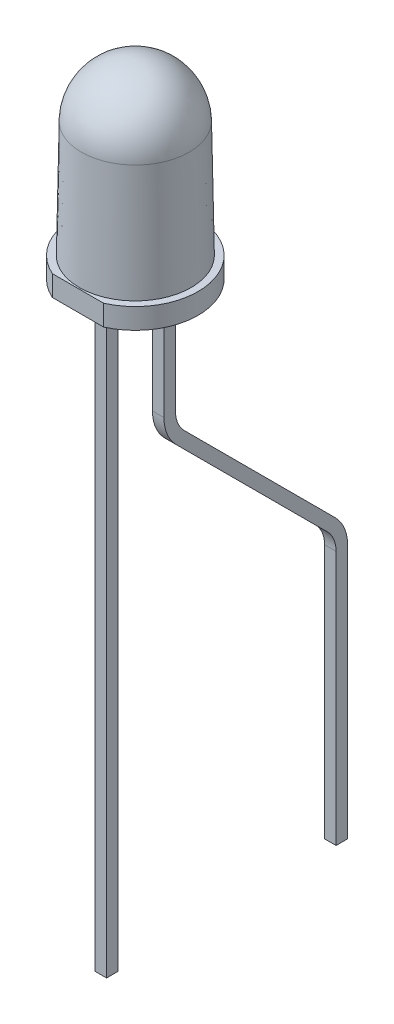
ISO-10303-21;
HEADER;
FILE_DESCRIPTION(('STEP AP214'),'2;1');
FILE_NAME('part.step','',(''),(''),'','','');
FILE_SCHEMA(('AUTOMOTIVE_DESIGN { 1 0 10303 214 1 1 1 1 }'));
ENDSEC;
DATA;
#1=APPLICATION_CONTEXT('core data for automotive mechanical design processes');
#2=APPLICATION_PROTOCOL_DEFINITION('international standard','automotive_design',2000,#1);
#3=PRODUCT_CONTEXT('',#1,'mechanical');
#4=PRODUCT('Part','Part','',(#3));
#5=PRODUCT_RELATED_PRODUCT_CATEGORY('part','',(#4));
#6=PRODUCT_DEFINITION_FORMATION('','',#4);
#7=PRODUCT_DEFINITION_CONTEXT('part definition',#1,'design');
#8=PRODUCT_DEFINITION('design','',#6,#7);
#9=PRODUCT_DEFINITION_SHAPE('','',#8);
#10=(LENGTH_UNIT() NAMED_UNIT(*) SI_UNIT(.MILLI.,.METRE.));
#11=(NAMED_UNIT(*) PLANE_ANGLE_UNIT() SI_UNIT($,.RADIAN.));
#12=(NAMED_UNIT(*) SI_UNIT($,.STERADIAN.) SOLID_ANGLE_UNIT());
#13=UNCERTAINTY_MEASURE_WITH_UNIT(LENGTH_MEASURE(1.E-05),#10,'distance_accuracy_value','');
#14=(GEOMETRIC_REPRESENTATION_CONTEXT(3) GLOBAL_UNCERTAINTY_ASSIGNED_CONTEXT((#13)) GLOBAL_UNIT_ASSIGNED_CONTEXT((#10,
#11,#12)) REPRESENTATION_CONTEXT('',''));
#15=CARTESIAN_POINT('',(0.,0.,0.));
#16=DIRECTION('',(0.,0.,1.));
#17=DIRECTION('',(1.,0.,0.));
#18=AXIS2_PLACEMENT_3D('',#15,#16,#17);
#19=CARTESIAN_POINT('',(0.,0.9144,-2.47649999999999));
#20=DIRECTION('',(0.,-1.,0.));
#21=DIRECTION('',(0.,0.,-1.));
#22=AXIS2_PLACEMENT_3D('',#19,#20,#21);
#23=PLANE('',#22);
#24=CARTESIAN_POINT('',(0.,0.914399999999998,0.));
#25=DIRECTION('',(0.,1.,0.));
#26=DIRECTION('',(0.,0.,1.));
#27=AXIS2_PLACEMENT_3D('',#24,#25,#26);
#28=CIRCLE('',#27,2.47649999999999);
#29=CARTESIAN_POINT('',(0.,0.914399999999995,2.4765));
#30=VERTEX_POINT('',#29);
#31=EDGE_CURVE('E299',#30,#30,#28,.T.);
#32=ORIENTED_EDGE('',*,*,#31,.F.);
#33=EDGE_LOOP('',(#32));
#34=FACE_BOUND('',#33,.T.);
#35=DIRECTION('',(-1.,0.,0.));
#36=VECTOR('',#35,1.);
#37=CARTESIAN_POINT('',(0.,0.914399999999994,2.54));
#38=LINE('',#37,#36);
#39=CARTESIAN_POINT('',(1.13315033865768,0.914399999999994,2.54));
#40=VERTEX_POINT('',#39);
#41=CARTESIAN_POINT('',(-1.1331503386577,0.914399999999994,2.53999999999999));
#42=VERTEX_POINT('',#41);
#43=EDGE_CURVE('E288',#40,#42,#38,.T.);
#44=ORIENTED_EDGE('',*,*,#43,.F.);
#45=CARTESIAN_POINT('',(0.,0.914399999999997,0.));
#46=DIRECTION('',(0.,1.,0.));
#47=DIRECTION('',(0.,0.,1.));
#48=AXIS2_PLACEMENT_3D('',#45,#46,#47);
#49=CIRCLE('',#48,2.7813);
#50=EDGE_CURVE('E290',#40,#42,#49,.T.);
#51=ORIENTED_EDGE('',*,*,#50,.T.);
#52=EDGE_LOOP('',(#44,#51));
#53=FACE_BOUND('',#52,.T.);
#54=ADVANCED_FACE('F32',(#34,#53),#23,.F.);
#55=CARTESIAN_POINT('',(0.,0.,0.));
#56=DIRECTION('',(0.,1.,0.));
#57=DIRECTION('',(0.,0.,1.));
#58=AXIS2_PLACEMENT_3D('',#55,#56,#57);
#59=PLANE('',#58);
#60=DIRECTION('',(1.,0.,0.));
#61=VECTOR('',#60,1.);
#62=CARTESIAN_POINT('',(0.254,0.,-1.016));
#63=LINE('',#62,#61);
#64=CARTESIAN_POINT('',(-0.254,0.,-1.016));
#65=VERTEX_POINT('',#64);
#66=CARTESIAN_POINT('',(0.254,0.,-1.016));
#67=VERTEX_POINT('',#66);
#68=EDGE_CURVE('E176',#65,#67,#63,.T.);
#69=ORIENTED_EDGE('',*,*,#68,.T.);
#70=DIRECTION('',(0.,0.,-1.));
#71=VECTOR('',#70,1.);
#72=CARTESIAN_POINT('',(0.254,0.,-1.016));
#73=LINE('',#72,#71);
#74=CARTESIAN_POINT('',(0.254,0.,-1.524));
#75=VERTEX_POINT('',#74);
#76=EDGE_CURVE('E414',#67,#75,#73,.T.);
#77=ORIENTED_EDGE('',*,*,#76,.T.);
#78=DIRECTION('',(-1.,0.,0.));
#79=VECTOR('',#78,1.);
#80=CARTESIAN_POINT('',(0.254,0.,-1.524));
#81=LINE('',#80,#79);
#82=CARTESIAN_POINT('',(-0.254,0.,-1.524));
#83=VERTEX_POINT('',#82);
#84=EDGE_CURVE('E180',#75,#83,#81,.T.);
#85=ORIENTED_EDGE('',*,*,#84,.T.);
#86=DIRECTION('',(0.,0.,1.));
#87=VECTOR('',#86,1.);
#88=CARTESIAN_POINT('',(-0.254,0.,-1.016));
#89=LINE('',#88,#87);
#90=EDGE_CURVE('E46',#83,#65,#89,.T.);
#91=ORIENTED_EDGE('',*,*,#90,.T.);
#92=EDGE_LOOP('',(#69,#77,#85,#91));
#93=FACE_BOUND('',#92,.T.);
#94=DIRECTION('',(1.,0.,0.));
#95=VECTOR('',#94,1.);
#96=CARTESIAN_POINT('',(0.254,0.,1.524));
#97=LINE('',#96,#95);
#98=CARTESIAN_POINT('',(-0.254,0.,1.524));
#99=VERTEX_POINT('',#98);
#100=CARTESIAN_POINT('',(0.254,0.,1.524));
#101=VERTEX_POINT('',#100);
#102=EDGE_CURVE('E261',#99,#101,#97,.T.);
#103=ORIENTED_EDGE('',*,*,#102,.T.);
#104=DIRECTION('',(0.,0.,-1.));
#105=VECTOR('',#104,1.);
#106=CARTESIAN_POINT('',(0.254,0.,1.524));
#107=LINE('',#106,#105);
#108=CARTESIAN_POINT('',(0.254,0.,1.016));
#109=VERTEX_POINT('',#108);
#110=EDGE_CURVE('E256',#101,#109,#107,.T.);
#111=ORIENTED_EDGE('',*,*,#110,.T.);
#112=DIRECTION('',(-1.,0.,0.));
#113=VECTOR('',#112,1.);
#114=CARTESIAN_POINT('',(0.254,0.,1.016));
#115=LINE('',#114,#113);
#116=CARTESIAN_POINT('',(-0.254,0.,1.016));
#117=VERTEX_POINT('',#116);
#118=EDGE_CURVE('E273',#109,#117,#115,.T.);
#119=ORIENTED_EDGE('',*,*,#118,.T.);
#120=DIRECTION('',(0.,0.,1.));
#121=VECTOR('',#120,1.);
#122=CARTESIAN_POINT('',(-0.254,0.,1.524));
#123=LINE('',#122,#121);
#124=EDGE_CURVE('E54',#117,#99,#123,.T.);
#125=ORIENTED_EDGE('',*,*,#124,.T.);
#126=EDGE_LOOP('',(#103,#111,#119,#125));
#127=FACE_BOUND('',#126,.T.);
#128=DIRECTION('',(1.,0.,0.));
#129=VECTOR('',#128,1.);
#130=CARTESIAN_POINT('',(0.,0.,2.54));
#131=LINE('',#130,#129);
#132=CARTESIAN_POINT('',(-1.1331503386577,0.,2.53999999999999));
#133=VERTEX_POINT('',#132);
#134=CARTESIAN_POINT('',(1.13315033865767,0.,2.54));
#135=VERTEX_POINT('',#134);
#136=EDGE_CURVE('E281',#133,#135,#131,.T.);
#137=ORIENTED_EDGE('',*,*,#136,.F.);
#138=CARTESIAN_POINT('',(0.,0.,0.));
#139=DIRECTION('',(0.,1.,0.));
#140=DIRECTION('',(0.,0.,1.));
#141=AXIS2_PLACEMENT_3D('',#138,#139,#140);
#142=CIRCLE('',#141,2.7813);
#143=EDGE_CURVE('E293',#135,#133,#142,.T.);
#144=ORIENTED_EDGE('',*,*,#143,.F.);
#145=EDGE_LOOP('',(#137,#144));
#146=FACE_BOUND('',#145,.T.);
#147=ADVANCED_FACE('F311',(#93,#127,#146),#59,.F.);
#148=CARTESIAN_POINT('',(0.,8.4074,0.));
#149=DIRECTION('',(0.,1.,0.));
#150=DIRECTION('',(0.,0.,1.));
#151=AXIS2_PLACEMENT_3D('',#148,#149,#150);
#152=CYLINDRICAL_SURFACE('',#151,2.7813);
#153=DIRECTION('',(0.,1.,0.));
#154=VECTOR('',#153,1.);
#155=CARTESIAN_POINT('',(1.1331503386577,8.4074,2.54));
#156=LINE('',#155,#154);
#157=EDGE_CURVE('E11',#135,#40,#156,.T.);
#158=ORIENTED_EDGE('',*,*,#157,.F.);
#159=ORIENTED_EDGE('',*,*,#143,.T.);
#160=DIRECTION('',(0.,1.,0.));
#161=VECTOR('',#160,1.);
#162=CARTESIAN_POINT('',(-1.1331503386577,8.4074,2.54));
#163=LINE('',#162,#161);
#164=EDGE_CURVE('E39',#42,#133,#163,.F.);
#165=ORIENTED_EDGE('',*,*,#164,.F.);
#166=ORIENTED_EDGE('',*,*,#50,.F.);
#167=EDGE_LOOP('',(#158,#159,#165,#166));
#168=FACE_BOUND('',#167,.T.);
#169=ADVANCED_FACE('F312',(#168),#152,.T.);
#170=CARTESIAN_POINT('',(0.,0.914399999999998,0.));
#171=DIRECTION('',(0.,-1.,0.));
#172=DIRECTION('',(0.,0.,-1.));
#173=AXIS2_PLACEMENT_3D('',#170,#171,#172);
#174=CONICAL_SURFACE('',#173,2.47649999999999,0.0172728670839645);
#175=CARTESIAN_POINT('',(0.,6.06068858252808,0.));
#176=DIRECTION('',(0.,1.,0.));
#177=DIRECTION('',(0.,0.,1.));
#178=AXIS2_PLACEMENT_3D('',#175,#176,#177);
#179=CIRCLE('',#178,2.3876);
#180=CARTESIAN_POINT('',(0.,6.06068858252808,2.3876));
#181=VERTEX_POINT('',#180);
#182=EDGE_CURVE('E296',#181,#181,#179,.T.);
#183=ORIENTED_EDGE('',*,*,#182,.F.);
#184=EDGE_LOOP('',(#183));
#185=FACE_BOUND('',#184,.T.);
#186=ORIENTED_EDGE('',*,*,#31,.T.);
#187=EDGE_LOOP('',(#186));
#188=FACE_BOUND('',#187,.T.);
#189=ADVANCED_FACE('F323',(#185,#188),#174,.T.);
#190=CARTESIAN_POINT('',(0.,6.01944378317489,0.));
#191=DIRECTION('',(0.,1.,0.));
#192=DIRECTION('',(0.,0.,-1.));
#193=AXIS2_PLACEMENT_3D('',#190,#191,#192);
#194=SPHERICAL_SURFACE('',#193,2.38795621682511);
#195=ORIENTED_EDGE('',*,*,#182,.T.);
#196=EDGE_LOOP('',(#195));
#197=FACE_BOUND('',#196,.T.);
#198=ADVANCED_FACE('F325',(#197),#194,.T.);
#199=CARTESIAN_POINT('',(-4.7358185416897,-1.52936306807305,2.54));
#200=DIRECTION('',(0.,0.,1.));
#201=DIRECTION('',(1.,0.,0.));
#202=AXIS2_PLACEMENT_3D('',#199,#200,#201);
#203=PLANE('',#202);
#204=ORIENTED_EDGE('',*,*,#157,.T.);
#205=ORIENTED_EDGE('',*,*,#43,.T.);
#206=ORIENTED_EDGE('',*,*,#164,.T.);
#207=ORIENTED_EDGE('',*,*,#136,.T.);
#208=EDGE_LOOP('',(#204,#205,#206,#207));
#209=FACE_BOUND('',#208,.T.);
#210=ADVANCED_FACE('F304',(#209),#203,.T.);
#211=CARTESIAN_POINT('',(0.254,-25.908,1.524));
#212=DIRECTION('',(1.,0.,0.));
#213=DIRECTION('',(0.,0.,-1.));
#214=AXIS2_PLACEMENT_3D('',#211,#212,#213);
#215=PLANE('',#214);
#216=ORIENTED_EDGE('',*,*,#110,.F.);
#217=DIRECTION('',(0.,1.,0.));
#218=VECTOR('',#217,1.);
#219=CARTESIAN_POINT('',(0.254,-25.908,1.524));
#220=LINE('',#219,#218);
#221=CARTESIAN_POINT('',(0.254,-25.908,1.524));
#222=VERTEX_POINT('',#221);
#223=EDGE_CURVE('E279',#222,#101,#220,.T.);
#224=ORIENTED_EDGE('',*,*,#223,.F.);
#225=DIRECTION('',(0.,0.,-1.));
#226=VECTOR('',#225,1.);
#227=CARTESIAN_POINT('',(0.254,-25.908,1.524));
#228=LINE('',#227,#226);
#229=CARTESIAN_POINT('',(0.254,-25.908,1.016));
#230=VERTEX_POINT('',#229);
#231=EDGE_CURVE('E257',#222,#230,#228,.T.);
#232=ORIENTED_EDGE('',*,*,#231,.T.);
#233=DIRECTION('',(0.,1.,0.));
#234=VECTOR('',#233,1.);
#235=CARTESIAN_POINT('',(0.254,-25.908,1.016));
#236=LINE('',#235,#234);
#237=EDGE_CURVE('E270',#230,#109,#236,.T.);
#238=ORIENTED_EDGE('',*,*,#237,.T.);
#239=EDGE_LOOP('',(#216,#224,#232,#238));
#240=FACE_BOUND('',#239,.T.);
#241=ADVANCED_FACE('F338',(#240),#215,.T.);
#242=CARTESIAN_POINT('',(0.254,-25.908,1.524));
#243=DIRECTION('',(0.,0.,1.));
#244=DIRECTION('',(1.,0.,0.));
#245=AXIS2_PLACEMENT_3D('',#242,#243,#244);
#246=PLANE('',#245);
#247=ORIENTED_EDGE('',*,*,#102,.F.);
#248=DIRECTION('',(0.,1.,0.));
#249=VECTOR('',#248,1.);
#250=CARTESIAN_POINT('',(-0.254,-25.908,1.524));
#251=LINE('',#250,#249);
#252=CARTESIAN_POINT('',(-0.254,-25.908,1.524));
#253=VERTEX_POINT('',#252);
#254=EDGE_CURVE('E282',#253,#99,#251,.T.);
#255=ORIENTED_EDGE('',*,*,#254,.F.);
#256=DIRECTION('',(1.,0.,0.));
#257=VECTOR('',#256,1.);
#258=CARTESIAN_POINT('',(0.254,-25.908,1.524));
#259=LINE('',#258,#257);
#260=EDGE_CURVE('E267',#253,#222,#259,.T.);
#261=ORIENTED_EDGE('',*,*,#260,.T.);
#262=ORIENTED_EDGE('',*,*,#223,.T.);
#263=EDGE_LOOP('',(#247,#255,#261,#262));
#264=FACE_BOUND('',#263,.T.);
#265=ADVANCED_FACE('F341',(#264),#246,.T.);
#266=CARTESIAN_POINT('',(-0.254,-25.908,1.524));
#267=DIRECTION('',(-1.,0.,0.));
#268=DIRECTION('',(0.,0.,1.));
#269=AXIS2_PLACEMENT_3D('',#266,#267,#268);
#270=PLANE('',#269);
#271=ORIENTED_EDGE('',*,*,#124,.F.);
#272=DIRECTION('',(0.,1.,0.));
#273=VECTOR('',#272,1.);
#274=CARTESIAN_POINT('',(-0.254,-25.908,1.016));
#275=LINE('',#274,#273);
#276=CARTESIAN_POINT('',(-0.254,-25.908,1.016));
#277=VERTEX_POINT('',#276);
#278=EDGE_CURVE('E284',#277,#117,#275,.T.);
#279=ORIENTED_EDGE('',*,*,#278,.F.);
#280=DIRECTION('',(0.,0.,1.));
#281=VECTOR('',#280,1.);
#282=CARTESIAN_POINT('',(-0.254,-25.908,1.524));
#283=LINE('',#282,#281);
#284=EDGE_CURVE('E264',#277,#253,#283,.T.);
#285=ORIENTED_EDGE('',*,*,#284,.T.);
#286=ORIENTED_EDGE('',*,*,#254,.T.);
#287=EDGE_LOOP('',(#271,#279,#285,#286));
#288=FACE_BOUND('',#287,.T.);
#289=ADVANCED_FACE('F347',(#288),#270,.T.);
#290=CARTESIAN_POINT('',(0.254,-25.908,1.016));
#291=DIRECTION('',(0.,0.,-1.));
#292=DIRECTION('',(-1.,0.,0.));
#293=AXIS2_PLACEMENT_3D('',#290,#291,#292);
#294=PLANE('',#293);
#295=ORIENTED_EDGE('',*,*,#118,.F.);
#296=ORIENTED_EDGE('',*,*,#237,.F.);
#297=DIRECTION('',(-1.,0.,0.));
#298=VECTOR('',#297,1.);
#299=CARTESIAN_POINT('',(0.254,-25.908,1.016));
#300=LINE('',#299,#298);
#301=EDGE_CURVE('E260',#230,#277,#300,.T.);
#302=ORIENTED_EDGE('',*,*,#301,.T.);
#303=ORIENTED_EDGE('',*,*,#278,.T.);
#304=EDGE_LOOP('',(#295,#296,#302,#303));
#305=FACE_BOUND('',#304,.T.);
#306=ADVANCED_FACE('F343',(#305),#294,.T.);
#307=CARTESIAN_POINT('',(0.254,-25.908,1.016));
#308=DIRECTION('',(0.,1.,0.));
#309=DIRECTION('',(0.,0.,1.));
#310=AXIS2_PLACEMENT_3D('',#307,#308,#309);
#311=PLANE('',#310);
#312=ORIENTED_EDGE('',*,*,#231,.F.);
#313=ORIENTED_EDGE('',*,*,#260,.F.);
#314=ORIENTED_EDGE('',*,*,#284,.F.);
#315=ORIENTED_EDGE('',*,*,#301,.F.);
#316=EDGE_LOOP('',(#312,#313,#314,#315));
#317=FACE_BOUND('',#316,.T.);
#318=ADVANCED_FACE('F346',(#317),#311,.F.);
#319=CARTESIAN_POINT('',(0.254,-14.6275640302673,-8.636));
#320=DIRECTION('',(0.,0.,-1.));
#321=DIRECTION('',(0.,1.,0.));
#322=AXIS2_PLACEMENT_3D('',#319,#320,#321);
#323=PLANE('',#322);
#324=DIRECTION('',(1.,0.,0.));
#325=VECTOR('',#324,1.);
#326=CARTESIAN_POINT('',(0.254,-14.6275640302673,-8.636));
#327=LINE('',#326,#325);
#328=CARTESIAN_POINT('',(-0.254,-14.6275640302673,-8.636));
#329=VERTEX_POINT('',#328);
#330=CARTESIAN_POINT('',(0.254,-14.6275640302673,-8.636));
#331=VERTEX_POINT('',#330);
#332=EDGE_CURVE('E221',#329,#331,#327,.T.);
#333=ORIENTED_EDGE('',*,*,#332,.F.);
#334=DIRECTION('',(0.,-1.,0.));
#335=VECTOR('',#334,1.);
#336=CARTESIAN_POINT('',(-0.254,-14.6275640302673,-8.636));
#337=LINE('',#336,#335);
#338=CARTESIAN_POINT('',(-0.254,-25.908,-8.636));
#339=VERTEX_POINT('',#338);
#340=EDGE_CURVE('E250',#329,#339,#337,.T.);
#341=ORIENTED_EDGE('',*,*,#340,.T.);
#342=DIRECTION('',(1.,0.,0.));
#343=VECTOR('',#342,1.);
#344=CARTESIAN_POINT('',(0.254,-25.908,-8.636));
#345=LINE('',#344,#343);
#346=CARTESIAN_POINT('',(0.254,-25.908,-8.636));
#347=VERTEX_POINT('',#346);
#348=EDGE_CURVE('E242',#339,#347,#345,.T.);
#349=ORIENTED_EDGE('',*,*,#348,.T.);
#350=DIRECTION('',(0.,-1.,0.));
#351=VECTOR('',#350,1.);
#352=CARTESIAN_POINT('',(0.254,-14.6275640302673,-8.636));
#353=LINE('',#352,#351);
#354=EDGE_CURVE('E253',#331,#347,#353,.T.);
#355=ORIENTED_EDGE('',*,*,#354,.F.);
#356=EDGE_LOOP('',(#333,#341,#349,#355));
#357=FACE_BOUND('',#356,.T.);
#358=ADVANCED_FACE('F356',(#357),#323,.F.);
#359=CARTESIAN_POINT('',(0.254,-14.6275640302673,-9.144));
#360=DIRECTION('',(0.,0.,1.));
#361=DIRECTION('',(0.,-1.,0.));
#362=AXIS2_PLACEMENT_3D('',#359,#360,#361);
#363=PLANE('',#362);
#364=DIRECTION('',(-1.,0.,0.));
#365=VECTOR('',#364,1.);
#366=CARTESIAN_POINT('',(0.254,-14.6275640302673,-9.144));
#367=LINE('',#366,#365);
#368=CARTESIAN_POINT('',(0.254,-14.6275640302673,-9.144));
#369=VERTEX_POINT('',#368);
#370=CARTESIAN_POINT('',(-0.254,-14.6275640302673,-9.144));
#371=VERTEX_POINT('',#370);
#372=EDGE_CURVE('E218',#369,#371,#367,.T.);
#373=ORIENTED_EDGE('',*,*,#372,.F.);
#374=DIRECTION('',(0.,-1.,0.));
#375=VECTOR('',#374,1.);
#376=CARTESIAN_POINT('',(0.254,-14.6275640302673,-9.144));
#377=LINE('',#376,#375);
#378=CARTESIAN_POINT('',(0.254,-25.908,-9.144));
#379=VERTEX_POINT('',#378);
#380=EDGE_CURVE('E244',#369,#379,#377,.T.);
#381=ORIENTED_EDGE('',*,*,#380,.T.);
#382=DIRECTION('',(-1.,0.,0.));
#383=VECTOR('',#382,1.);
#384=CARTESIAN_POINT('',(0.254,-25.908,-9.144));
#385=LINE('',#384,#383);
#386=CARTESIAN_POINT('',(-0.254,-25.908,-9.144));
#387=VERTEX_POINT('',#386);
#388=EDGE_CURVE('E238',#379,#387,#385,.T.);
#389=ORIENTED_EDGE('',*,*,#388,.T.);
#390=DIRECTION('',(0.,-1.,0.));
#391=VECTOR('',#390,1.);
#392=CARTESIAN_POINT('',(-0.254,-14.6275640302673,-9.144));
#393=LINE('',#392,#391);
#394=EDGE_CURVE('E247',#371,#387,#393,.T.);
#395=ORIENTED_EDGE('',*,*,#394,.F.);
#396=EDGE_LOOP('',(#373,#381,#389,#395));
#397=FACE_BOUND('',#396,.T.);
#398=ADVANCED_FACE('F360',(#397),#363,.F.);
#399=CARTESIAN_POINT('',(0.,-14.6275640302673,-7.3025));
#400=DIRECTION('',(-1.,0.,0.));
#401=DIRECTION('',(0.,0.,1.));
#402=AXIS2_PLACEMENT_3D('',#399,#400,#401);
#403=CYLINDRICAL_SURFACE('',#402,1.3335);
#404=DIRECTION('',(1.,0.,0.));
#405=VECTOR('',#404,1.);
#406=CARTESIAN_POINT('',(0.254,-13.684637137555,-8.24542689271226));
#407=LINE('',#406,#405);
#408=CARTESIAN_POINT('',(-0.254,-13.684637137555,-8.24542689271226));
#409=VERTEX_POINT('',#408);
#410=CARTESIAN_POINT('',(0.254,-13.684637137555,-8.24542689271226));
#411=VERTEX_POINT('',#410);
#412=EDGE_CURVE('E205',#409,#411,#407,.T.);
#413=ORIENTED_EDGE('',*,*,#412,.F.);
#414=CARTESIAN_POINT('',(-0.254,-14.6275640302673,-7.3025));
#415=DIRECTION('',(-1.,0.,0.));
#416=DIRECTION('',(0.,0.,1.));
#417=AXIS2_PLACEMENT_3D('',#414,#415,#416);
#418=CIRCLE('',#417,1.3335);
#419=EDGE_CURVE('E230',#409,#329,#418,.T.);
#420=ORIENTED_EDGE('',*,*,#419,.T.);
#421=ORIENTED_EDGE('',*,*,#332,.T.);
#422=CARTESIAN_POINT('',(0.254,-14.6275640302673,-7.3025));
#423=DIRECTION('',(-1.,0.,0.));
#424=DIRECTION('',(0.,0.,1.));
#425=AXIS2_PLACEMENT_3D('',#422,#423,#424);
#426=CIRCLE('',#425,1.3335);
#427=EDGE_CURVE('E233',#411,#331,#426,.T.);
#428=ORIENTED_EDGE('',*,*,#427,.F.);
#429=EDGE_LOOP('',(#413,#420,#421,#428));
#430=FACE_BOUND('',#429,.T.);
#431=ADVANCED_FACE('F364',(#430),#403,.F.);
#432=CARTESIAN_POINT('',(0.,-14.6275640302673,-7.3025));
#433=DIRECTION('',(-1.,0.,0.));
#434=DIRECTION('',(0.,0.,1.));
#435=AXIS2_PLACEMENT_3D('',#432,#433,#434);
#436=CYLINDRICAL_SURFACE('',#435,1.8415);
#437=DIRECTION('',(-1.,0.,0.));
#438=VECTOR('',#437,1.);
#439=CARTESIAN_POINT('',(0.254,-13.3254268927122,-8.60463713755503));
#440=LINE('',#439,#438);
#441=CARTESIAN_POINT('',(0.254,-13.3254268927122,-8.60463713755503));
#442=VERTEX_POINT('',#441);
#443=CARTESIAN_POINT('',(-0.254,-13.3254268927122,-8.60463713755503));
#444=VERTEX_POINT('',#443);
#445=EDGE_CURVE('E202',#442,#444,#440,.T.);
#446=ORIENTED_EDGE('',*,*,#445,.F.);
#447=CARTESIAN_POINT('',(0.254,-14.6275640302673,-7.3025));
#448=DIRECTION('',(-1.,0.,0.));
#449=DIRECTION('',(0.,0.,1.));
#450=AXIS2_PLACEMENT_3D('',#447,#448,#449);
#451=CIRCLE('',#450,1.8415);
#452=EDGE_CURVE('E224',#442,#369,#451,.T.);
#453=ORIENTED_EDGE('',*,*,#452,.T.);
#454=ORIENTED_EDGE('',*,*,#372,.T.);
#455=CARTESIAN_POINT('',(-0.254,-14.6275640302673,-7.3025));
#456=DIRECTION('',(-1.,0.,0.));
#457=DIRECTION('',(0.,0.,1.));
#458=AXIS2_PLACEMENT_3D('',#455,#456,#457);
#459=CIRCLE('',#458,1.8415);
#460=EDGE_CURVE('E227',#444,#371,#459,.T.);
#461=ORIENTED_EDGE('',*,*,#460,.F.);
#462=EDGE_LOOP('',(#446,#453,#454,#461));
#463=FACE_BOUND('',#462,.T.);
#464=ADVANCED_FACE('F368',(#463),#436,.T.);
#465=CARTESIAN_POINT('',(0.254,-6.99457310728774,-1.55536286244498));
#466=DIRECTION('',(0.,0.707106781186549,-0.707106781186546));
#467=DIRECTION('',(0.,0.707106781186546,0.707106781186549));
#468=AXIS2_PLACEMENT_3D('',#465,#466,#467);
#469=PLANE('',#468);
#470=DIRECTION('',(1.,0.,0.));
#471=VECTOR('',#470,1.);
#472=CARTESIAN_POINT('',(0.254,-6.99457310728774,-1.55536286244498));
#473=LINE('',#472,#471);
#474=CARTESIAN_POINT('',(-0.254,-6.99457310728774,-1.55536286244498));
#475=VERTEX_POINT('',#474);
#476=CARTESIAN_POINT('',(0.254,-6.99457310728774,-1.55536286244498));
#477=VERTEX_POINT('',#476);
#478=EDGE_CURVE('E168',#475,#477,#473,.T.);
#479=ORIENTED_EDGE('',*,*,#478,.F.);
#480=DIRECTION('',(0.,-0.707106781186546,-0.707106781186549));
#481=VECTOR('',#480,1.);
#482=CARTESIAN_POINT('',(-0.254,-6.99457310728774,-1.55536286244498));
#483=LINE('',#482,#481);
#484=EDGE_CURVE('E212',#475,#409,#483,.T.);
#485=ORIENTED_EDGE('',*,*,#484,.T.);
#486=ORIENTED_EDGE('',*,*,#412,.T.);
#487=DIRECTION('',(0.,-0.707106781186546,-0.707106781186549));
#488=VECTOR('',#487,1.);
#489=CARTESIAN_POINT('',(0.254,-6.99457310728774,-1.55536286244498));
#490=LINE('',#489,#488);
#491=EDGE_CURVE('E215',#477,#411,#490,.T.);
#492=ORIENTED_EDGE('',*,*,#491,.F.);
#493=EDGE_LOOP('',(#479,#485,#486,#492));
#494=FACE_BOUND('',#493,.T.);
#495=ADVANCED_FACE('F372',(#494),#469,.F.);
#496=CARTESIAN_POINT('',(0.254,-6.63536286244497,-1.91457310728774));
#497=DIRECTION('',(0.,-0.707106781186549,0.707106781186546));
#498=DIRECTION('',(0.,-0.707106781186546,-0.707106781186549));
#499=AXIS2_PLACEMENT_3D('',#496,#497,#498);
#500=PLANE('',#499);
#501=DIRECTION('',(-1.,0.,0.));
#502=VECTOR('',#501,1.);
#503=CARTESIAN_POINT('',(0.254,-6.63536286244497,-1.91457310728774));
#504=LINE('',#503,#502);
#505=CARTESIAN_POINT('',(0.254,-6.63536286244497,-1.91457310728774));
#506=VERTEX_POINT('',#505);
#507=CARTESIAN_POINT('',(-0.254,-6.63536286244497,-1.91457310728774));
#508=VERTEX_POINT('',#507);
#509=EDGE_CURVE('E190',#506,#508,#504,.T.);
#510=ORIENTED_EDGE('',*,*,#509,.F.);
#511=DIRECTION('',(0.,-0.707106781186546,-0.707106781186549));
#512=VECTOR('',#511,1.);
#513=CARTESIAN_POINT('',(0.254,-6.63536286244497,-1.91457310728774));
#514=LINE('',#513,#512);
#515=EDGE_CURVE('E163',#506,#442,#514,.T.);
#516=ORIENTED_EDGE('',*,*,#515,.T.);
#517=ORIENTED_EDGE('',*,*,#445,.T.);
#518=DIRECTION('',(0.,-0.707106781186546,-0.707106781186549));
#519=VECTOR('',#518,1.);
#520=CARTESIAN_POINT('',(-0.254,-6.63536286244497,-1.91457310728774));
#521=LINE('',#520,#519);
#522=EDGE_CURVE('E209',#508,#444,#521,.T.);
#523=ORIENTED_EDGE('',*,*,#522,.F.);
#524=EDGE_LOOP('',(#510,#516,#517,#523));
#525=FACE_BOUND('',#524,.T.);
#526=ADVANCED_FACE('F376',(#525),#500,.F.);
#527=CARTESIAN_POINT('',(0.,-5.69243596973271,-2.8575));
#528=DIRECTION('',(1.,0.,0.));
#529=DIRECTION('',(0.,0.,-1.));
#530=AXIS2_PLACEMENT_3D('',#527,#528,#529);
#531=CYLINDRICAL_SURFACE('',#530,1.8415);
#532=DIRECTION('',(1.,0.,0.));
#533=VECTOR('',#532,1.);
#534=CARTESIAN_POINT('',(0.254,-5.69243596973271,-1.016));
#535=LINE('',#534,#533);
#536=CARTESIAN_POINT('',(-0.254,-5.69243596973271,-1.016));
#537=VERTEX_POINT('',#536);
#538=CARTESIAN_POINT('',(0.254,-5.69243596973271,-1.016));
#539=VERTEX_POINT('',#538);
#540=EDGE_CURVE('E175',#537,#539,#535,.T.);
#541=ORIENTED_EDGE('',*,*,#540,.F.);
#542=CARTESIAN_POINT('',(-0.254,-5.69243596973271,-2.8575));
#543=DIRECTION('',(1.,0.,0.));
#544=DIRECTION('',(0.,0.,-1.));
#545=AXIS2_PLACEMENT_3D('',#542,#543,#544);
#546=CIRCLE('',#545,1.8415);
#547=EDGE_CURVE('E196',#537,#475,#546,.T.);
#548=ORIENTED_EDGE('',*,*,#547,.T.);
#549=ORIENTED_EDGE('',*,*,#478,.T.);
#550=CARTESIAN_POINT('',(0.254,-5.69243596973271,-2.8575));
#551=DIRECTION('',(1.,0.,0.));
#552=DIRECTION('',(0.,0.,-1.));
#553=AXIS2_PLACEMENT_3D('',#550,#551,#552);
#554=CIRCLE('',#553,1.8415);
#555=EDGE_CURVE('E199',#539,#477,#554,.T.);
#556=ORIENTED_EDGE('',*,*,#555,.F.);
#557=EDGE_LOOP('',(#541,#548,#549,#556));
#558=FACE_BOUND('',#557,.T.);
#559=ADVANCED_FACE('F380',(#558),#531,.T.);
#560=CARTESIAN_POINT('',(0.,-5.69243596973271,-2.8575));
#561=DIRECTION('',(1.,0.,0.));
#562=DIRECTION('',(0.,0.,-1.));
#563=AXIS2_PLACEMENT_3D('',#560,#561,#562);
#564=CYLINDRICAL_SURFACE('',#563,1.3335);
#565=DIRECTION('',(-1.,0.,0.));
#566=VECTOR('',#565,1.);
#567=CARTESIAN_POINT('',(0.254,-5.69243596973271,-1.524));
#568=LINE('',#567,#566);
#569=CARTESIAN_POINT('',(0.254,-5.69243596973271,-1.524));
#570=VERTEX_POINT('',#569);
#571=CARTESIAN_POINT('',(-0.254,-5.69243596973271,-1.524));
#572=VERTEX_POINT('',#571);
#573=EDGE_CURVE('E171',#570,#572,#568,.T.);
#574=ORIENTED_EDGE('',*,*,#573,.F.);
#575=CARTESIAN_POINT('',(0.254,-5.69243596973271,-2.8575));
#576=DIRECTION('',(1.,0.,0.));
#577=DIRECTION('',(0.,0.,-1.));
#578=AXIS2_PLACEMENT_3D('',#575,#576,#577);
#579=CIRCLE('',#578,1.3335);
#580=EDGE_CURVE('E155',#570,#506,#579,.T.);
#581=ORIENTED_EDGE('',*,*,#580,.T.);
#582=ORIENTED_EDGE('',*,*,#509,.T.);
#583=CARTESIAN_POINT('',(-0.254,-5.69243596973271,-2.8575));
#584=DIRECTION('',(1.,0.,0.));
#585=DIRECTION('',(0.,0.,-1.));
#586=AXIS2_PLACEMENT_3D('',#583,#584,#585);
#587=CIRCLE('',#586,1.3335);
#588=EDGE_CURVE('E167',#572,#508,#587,.T.);
#589=ORIENTED_EDGE('',*,*,#588,.F.);
#590=EDGE_LOOP('',(#574,#581,#582,#589));
#591=FACE_BOUND('',#590,.T.);
#592=ADVANCED_FACE('F172',(#591),#564,.F.);
#593=CARTESIAN_POINT('',(0.254,-5.69243596973271,-1.016));
#594=DIRECTION('',(1.,0.,0.));
#595=DIRECTION('',(0.,0.,-1.));
#596=AXIS2_PLACEMENT_3D('',#593,#594,#595);
#597=PLANE('',#596);
#598=ORIENTED_EDGE('',*,*,#76,.F.);
#599=DIRECTION('',(0.,1.,0.));
#600=VECTOR('',#599,1.);
#601=CARTESIAN_POINT('',(0.254,-5.69243596973271,-1.016));
#602=LINE('',#601,#600);
#603=EDGE_CURVE('E192',#539,#67,#602,.T.);
#604=ORIENTED_EDGE('',*,*,#603,.F.);
#605=ORIENTED_EDGE('',*,*,#555,.T.);
#606=ORIENTED_EDGE('',*,*,#491,.T.);
#607=ORIENTED_EDGE('',*,*,#427,.T.);
#608=ORIENTED_EDGE('',*,*,#354,.T.);
#609=DIRECTION('',(0.,0.,-1.));
#610=VECTOR('',#609,1.);
#611=CARTESIAN_POINT('',(0.254,-25.908,-8.636));
#612=LINE('',#611,#610);
#613=EDGE_CURVE('E236',#347,#379,#612,.T.);
#614=ORIENTED_EDGE('',*,*,#613,.T.);
#615=ORIENTED_EDGE('',*,*,#380,.F.);
#616=ORIENTED_EDGE('',*,*,#452,.F.);
#617=ORIENTED_EDGE('',*,*,#515,.F.);
#618=ORIENTED_EDGE('',*,*,#580,.F.);
#619=DIRECTION('',(0.,1.,0.));
#620=VECTOR('',#619,1.);
#621=CARTESIAN_POINT('',(0.254,-5.69243596973271,-1.524));
#622=LINE('',#621,#620);
#623=EDGE_CURVE('E160',#570,#75,#622,.T.);
#624=ORIENTED_EDGE('',*,*,#623,.T.);
#625=EDGE_LOOP('',(#598,#604,#605,#606,#607,#608,#614,#615,#616,#617,#618,#624));
#626=FACE_BOUND('',#625,.T.);
#627=ADVANCED_FACE('F158',(#626),#597,.T.);
#628=CARTESIAN_POINT('',(0.254,-5.69243596973271,-1.016));
#629=DIRECTION('',(0.,0.,1.));
#630=DIRECTION('',(0.,-1.,0.));
#631=AXIS2_PLACEMENT_3D('',#628,#629,#630);
#632=PLANE('',#631);
#633=ORIENTED_EDGE('',*,*,#68,.F.);
#634=DIRECTION('',(0.,1.,0.));
#635=VECTOR('',#634,1.);
#636=CARTESIAN_POINT('',(-0.254,-5.69243596973271,-1.016));
#637=LINE('',#636,#635);
#638=EDGE_CURVE('E184',#537,#65,#637,.T.);
#639=ORIENTED_EDGE('',*,*,#638,.F.);
#640=ORIENTED_EDGE('',*,*,#540,.T.);
#641=ORIENTED_EDGE('',*,*,#603,.T.);
#642=EDGE_LOOP('',(#633,#639,#640,#641));
#643=FACE_BOUND('',#642,.T.);
#644=ADVANCED_FACE('F389',(#643),#632,.T.);
#645=CARTESIAN_POINT('',(-0.254,-5.69243596973271,-1.016));
#646=DIRECTION('',(-1.,0.,0.));
#647=DIRECTION('',(0.,0.,1.));
#648=AXIS2_PLACEMENT_3D('',#645,#646,#647);
#649=PLANE('',#648);
#650=ORIENTED_EDGE('',*,*,#90,.F.);
#651=DIRECTION('',(0.,1.,0.));
#652=VECTOR('',#651,1.);
#653=CARTESIAN_POINT('',(-0.254,-5.69243596973271,-1.524));
#654=LINE('',#653,#652);
#655=EDGE_CURVE('E182',#572,#83,#654,.T.);
#656=ORIENTED_EDGE('',*,*,#655,.F.);
#657=ORIENTED_EDGE('',*,*,#588,.T.);
#658=ORIENTED_EDGE('',*,*,#522,.T.);
#659=ORIENTED_EDGE('',*,*,#460,.T.);
#660=ORIENTED_EDGE('',*,*,#394,.T.);
#661=DIRECTION('',(0.,0.,1.));
#662=VECTOR('',#661,1.);
#663=CARTESIAN_POINT('',(-0.254,-25.908,-8.636));
#664=LINE('',#663,#662);
#665=EDGE_CURVE('E240',#387,#339,#664,.T.);
#666=ORIENTED_EDGE('',*,*,#665,.T.);
#667=ORIENTED_EDGE('',*,*,#340,.F.);
#668=ORIENTED_EDGE('',*,*,#419,.F.);
#669=ORIENTED_EDGE('',*,*,#484,.F.);
#670=ORIENTED_EDGE('',*,*,#547,.F.);
#671=ORIENTED_EDGE('',*,*,#638,.T.);
#672=EDGE_LOOP('',(#650,#656,#657,#658,#659,#660,#666,#667,#668,#669,#670,#671));
#673=FACE_BOUND('',#672,.T.);
#674=ADVANCED_FACE('F393',(#673),#649,.T.);
#675=CARTESIAN_POINT('',(0.254,-5.69243596973271,-1.524));
#676=DIRECTION('',(0.,0.,-1.));
#677=DIRECTION('',(0.,1.,0.));
#678=AXIS2_PLACEMENT_3D('',#675,#676,#677);
#679=PLANE('',#678);
#680=ORIENTED_EDGE('',*,*,#84,.F.);
#681=ORIENTED_EDGE('',*,*,#623,.F.);
#682=ORIENTED_EDGE('',*,*,#573,.T.);
#683=ORIENTED_EDGE('',*,*,#655,.T.);
#684=EDGE_LOOP('',(#680,#681,#682,#683));
#685=FACE_BOUND('',#684,.T.);
#686=ADVANCED_FACE('F178',(#685),#679,.T.);
#687=CARTESIAN_POINT('',(0.254,-25.908,-9.144));
#688=DIRECTION('',(0.,1.,0.));
#689=DIRECTION('',(0.,0.,1.));
#690=AXIS2_PLACEMENT_3D('',#687,#688,#689);
#691=PLANE('',#690);
#692=ORIENTED_EDGE('',*,*,#613,.F.);
#693=ORIENTED_EDGE('',*,*,#348,.F.);
#694=ORIENTED_EDGE('',*,*,#665,.F.);
#695=ORIENTED_EDGE('',*,*,#388,.F.);
#696=EDGE_LOOP('',(#692,#693,#694,#695));
#697=FACE_BOUND('',#696,.T.);
#698=ADVANCED_FACE('F392',(#697),#691,.F.);
#699=CLOSED_SHELL('',(#54,#147,#169,#189,#198,#210,#241,#265,#289,#306,#318,#358,#398,#431,#464,
#495,#526,#559,#592,#627,#644,#674,#686,#698));
#700=MANIFOLD_SOLID_BREP('B2',#699);
#701=ADVANCED_BREP_SHAPE_REPRESENTATION('',(#18,#700),#14);
#702=SHAPE_DEFINITION_REPRESENTATION(#9,#701);
ENDSEC;
END-ISO-10303-21;
